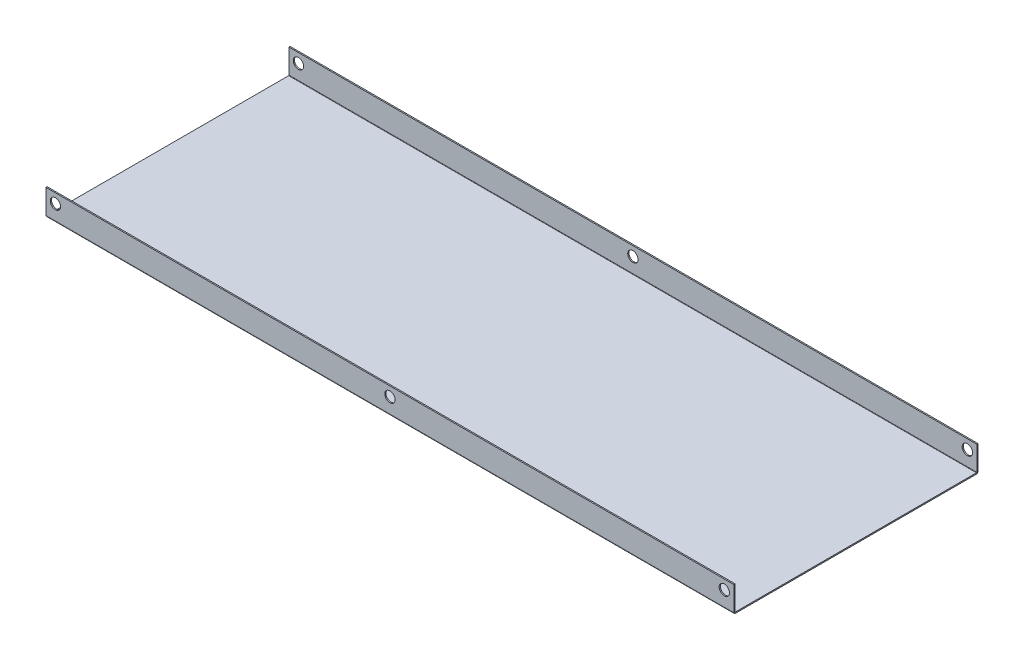
ISO-10303-21;
HEADER;
FILE_DESCRIPTION(('STEP AP214'),'2;1');
FILE_NAME('part.step','',(''),(''),'','','');
FILE_SCHEMA(('AUTOMOTIVE_DESIGN { 1 0 10303 214 1 1 1 1 }'));
ENDSEC;
DATA;
#1=APPLICATION_CONTEXT('core data for automotive mechanical design processes');
#2=APPLICATION_PROTOCOL_DEFINITION('international standard','automotive_design',2000,#1);
#3=PRODUCT_CONTEXT('',#1,'mechanical');
#4=PRODUCT('Part','Part','',(#3));
#5=PRODUCT_RELATED_PRODUCT_CATEGORY('part','',(#4));
#6=PRODUCT_DEFINITION_FORMATION('','',#4);
#7=PRODUCT_DEFINITION_CONTEXT('part definition',#1,'design');
#8=PRODUCT_DEFINITION('design','',#6,#7);
#9=PRODUCT_DEFINITION_SHAPE('','',#8);
#10=(LENGTH_UNIT() NAMED_UNIT(*) SI_UNIT(.MILLI.,.METRE.));
#11=(NAMED_UNIT(*) PLANE_ANGLE_UNIT() SI_UNIT($,.RADIAN.));
#12=(NAMED_UNIT(*) SI_UNIT($,.STERADIAN.) SOLID_ANGLE_UNIT());
#13=UNCERTAINTY_MEASURE_WITH_UNIT(LENGTH_MEASURE(1.E-05),#10,'distance_accuracy_value','');
#14=(GEOMETRIC_REPRESENTATION_CONTEXT(3) GLOBAL_UNCERTAINTY_ASSIGNED_CONTEXT((#13)) GLOBAL_UNIT_ASSIGNED_CONTEXT((#10,
#11,#12)) REPRESENTATION_CONTEXT('',''));
#15=CARTESIAN_POINT('',(0.,0.,0.));
#16=DIRECTION('',(0.,0.,1.));
#17=DIRECTION('',(1.,0.,0.));
#18=AXIS2_PLACEMENT_3D('',#15,#16,#17);
#19=CARTESIAN_POINT('',(0.,-0.7,0.));
#20=DIRECTION('',(0.,-1.,0.));
#21=DIRECTION('',(0.,0.,-1.));
#22=AXIS2_PLACEMENT_3D('',#19,#20,#21);
#23=PLANE('',#22);
#24=DIRECTION('',(0.,0.,-1.));
#25=VECTOR('',#24,1.);
#26=CARTESIAN_POINT('',(200.,-0.7,71.));
#27=LINE('',#26,#25);
#28=CARTESIAN_POINT('',(200.,-0.699999999999993,70.1));
#29=VERTEX_POINT('',#28);
#30=CARTESIAN_POINT('',(200.,-0.7,-70.1));
#31=VERTEX_POINT('',#30);
#32=EDGE_CURVE('E91',#29,#31,#27,.T.);
#33=ORIENTED_EDGE('',*,*,#32,.F.);
#34=DIRECTION('',(1.,0.,0.));
#35=VECTOR('',#34,1.);
#36=CARTESIAN_POINT('',(200.,-0.699999999999993,70.1));
#37=LINE('',#36,#35);
#38=CARTESIAN_POINT('',(-200.,-0.7,70.1));
#39=VERTEX_POINT('',#38);
#40=EDGE_CURVE('E227',#29,#39,#37,.F.);
#41=ORIENTED_EDGE('',*,*,#40,.T.);
#42=DIRECTION('',(0.,0.,1.));
#43=VECTOR('',#42,1.);
#44=CARTESIAN_POINT('',(-200.,-0.7,71.));
#45=LINE('',#44,#43);
#46=CARTESIAN_POINT('',(-200.,-0.700000000000022,-70.1));
#47=VERTEX_POINT('',#46);
#48=EDGE_CURVE('E13',#47,#39,#45,.T.);
#49=ORIENTED_EDGE('',*,*,#48,.F.);
#50=DIRECTION('',(-1.,0.,0.));
#51=VECTOR('',#50,1.);
#52=CARTESIAN_POINT('',(-200.,-0.700000000000022,-70.1));
#53=LINE('',#52,#51);
#54=EDGE_CURVE('E298',#47,#31,#53,.F.);
#55=ORIENTED_EDGE('',*,*,#54,.T.);
#56=EDGE_LOOP('',(#33,#41,#49,#55));
#57=FACE_BOUND('',#56,.T.);
#58=ADVANCED_FACE('F81',(#57),#23,.T.);
#59=CARTESIAN_POINT('',(0.,0.,0.));
#60=DIRECTION('',(0.,-1.,0.));
#61=DIRECTION('',(0.,0.,-1.));
#62=AXIS2_PLACEMENT_3D('',#59,#60,#61);
#63=PLANE('',#62);
#64=DIRECTION('',(1.,0.,0.));
#65=VECTOR('',#64,1.);
#66=CARTESIAN_POINT('',(200.,0.,70.1));
#67=LINE('',#66,#65);
#68=CARTESIAN_POINT('',(200.,0.,70.1));
#69=VERTEX_POINT('',#68);
#70=CARTESIAN_POINT('',(-200.,0.,70.1));
#71=VERTEX_POINT('',#70);
#72=EDGE_CURVE('E242',#69,#71,#67,.F.);
#73=ORIENTED_EDGE('',*,*,#72,.F.);
#74=DIRECTION('',(0.,0.,-1.));
#75=VECTOR('',#74,1.);
#76=CARTESIAN_POINT('',(200.,0.,71.));
#77=LINE('',#76,#75);
#78=CARTESIAN_POINT('',(200.,0.,-70.1));
#79=VERTEX_POINT('',#78);
#80=EDGE_CURVE('E322',#69,#79,#77,.T.);
#81=ORIENTED_EDGE('',*,*,#80,.T.);
#82=DIRECTION('',(-1.,0.,0.));
#83=VECTOR('',#82,1.);
#84=CARTESIAN_POINT('',(-200.,0.,-70.1));
#85=LINE('',#84,#83);
#86=CARTESIAN_POINT('',(-200.,0.,-70.1));
#87=VERTEX_POINT('',#86);
#88=EDGE_CURVE('E313',#87,#79,#85,.F.);
#89=ORIENTED_EDGE('',*,*,#88,.F.);
#90=DIRECTION('',(0.,0.,1.));
#91=VECTOR('',#90,1.);
#92=CARTESIAN_POINT('',(-200.,0.,71.));
#93=LINE('',#92,#91);
#94=EDGE_CURVE('E328',#87,#71,#93,.T.);
#95=ORIENTED_EDGE('',*,*,#94,.T.);
#96=EDGE_LOOP('',(#73,#81,#89,#95));
#97=FACE_BOUND('',#96,.T.);
#98=ADVANCED_FACE('F399',(#97),#63,.F.);
#99=CARTESIAN_POINT('',(200.,-0.7,71.));
#100=DIRECTION('',(1.,0.,0.));
#101=DIRECTION('',(0.,0.,-1.));
#102=AXIS2_PLACEMENT_3D('',#99,#100,#101);
#103=PLANE('',#102);
#104=ORIENTED_EDGE('',*,*,#80,.F.);
#105=DIRECTION('',(0.,-1.,0.));
#106=VECTOR('',#105,1.);
#107=CARTESIAN_POINT('',(200.,0.,70.1));
#108=LINE('',#107,#106);
#109=EDGE_CURVE('E234',#69,#29,#108,.T.);
#110=ORIENTED_EDGE('',*,*,#109,.T.);
#111=ORIENTED_EDGE('',*,*,#32,.T.);
#112=DIRECTION('',(0.,-1.,0.));
#113=VECTOR('',#112,1.);
#114=CARTESIAN_POINT('',(200.,0.,-70.1));
#115=LINE('',#114,#113);
#116=EDGE_CURVE('E319',#79,#31,#115,.T.);
#117=ORIENTED_EDGE('',*,*,#116,.F.);
#118=EDGE_LOOP('',(#104,#110,#111,#117));
#119=FACE_BOUND('',#118,.T.);
#120=ADVANCED_FACE('F83',(#119),#103,.T.);
#121=CARTESIAN_POINT('',(-200.,-0.7,71.));
#122=DIRECTION('',(-1.,0.,0.));
#123=DIRECTION('',(0.,0.,1.));
#124=AXIS2_PLACEMENT_3D('',#121,#122,#123);
#125=PLANE('',#124);
#126=DIRECTION('',(0.,-1.,0.));
#127=VECTOR('',#126,1.);
#128=CARTESIAN_POINT('',(-200.,0.,70.1));
#129=LINE('',#128,#127);
#130=EDGE_CURVE('E249',#71,#39,#129,.T.);
#131=ORIENTED_EDGE('',*,*,#130,.F.);
#132=ORIENTED_EDGE('',*,*,#94,.F.);
#133=DIRECTION('',(0.,-1.,0.));
#134=VECTOR('',#133,1.);
#135=CARTESIAN_POINT('',(-200.,0.,-70.1));
#136=LINE('',#135,#134);
#137=EDGE_CURVE('E305',#87,#47,#136,.T.);
#138=ORIENTED_EDGE('',*,*,#137,.T.);
#139=ORIENTED_EDGE('',*,*,#48,.T.);
#140=EDGE_LOOP('',(#131,#132,#138,#139));
#141=FACE_BOUND('',#140,.T.);
#142=ADVANCED_FACE('F411',(#141),#125,.T.);
#143=CARTESIAN_POINT('',(200.,0.200000000000011,-70.1));
#144=DIRECTION('',(1.,0.,0.));
#145=DIRECTION('',(0.,1.,0.));
#146=AXIS2_PLACEMENT_3D('',#143,#144,#145);
#147=PLANE('',#146);
#148=DIRECTION('',(0.,0.,1.));
#149=VECTOR('',#148,1.);
#150=CARTESIAN_POINT('',(200.,0.200000000000011,-71.));
#151=LINE('',#150,#149);
#152=CARTESIAN_POINT('',(200.,0.20000000000001,-70.3));
#153=VERTEX_POINT('',#152);
#154=CARTESIAN_POINT('',(200.,0.200000000000007,-71.));
#155=VERTEX_POINT('',#154);
#156=EDGE_CURVE('E252',#153,#155,#151,.F.);
#157=ORIENTED_EDGE('',*,*,#156,.F.);
#158=CARTESIAN_POINT('',(200.,0.200000000000011,-70.1));
#159=DIRECTION('',(-1.,0.,0.));
#160=DIRECTION('',(0.,-1.,0.));
#161=AXIS2_PLACEMENT_3D('',#158,#159,#160);
#162=CIRCLE('',#161,0.200000000000006);
#163=EDGE_CURVE('E309',#79,#153,#162,.F.);
#164=ORIENTED_EDGE('',*,*,#163,.F.);
#165=ORIENTED_EDGE('',*,*,#116,.T.);
#166=CARTESIAN_POINT('',(200.,0.200000000000011,-70.1));
#167=DIRECTION('',(-1.,0.,0.));
#168=DIRECTION('',(0.,-1.,0.));
#169=AXIS2_PLACEMENT_3D('',#166,#167,#168);
#170=CIRCLE('',#169,0.900000000000006);
#171=EDGE_CURVE('E99',#31,#155,#170,.F.);
#172=ORIENTED_EDGE('',*,*,#171,.T.);
#173=EDGE_LOOP('',(#157,#164,#165,#172));
#174=FACE_BOUND('',#173,.T.);
#175=ADVANCED_FACE('F413',(#174),#147,.T.);
#176=CARTESIAN_POINT('',(-200.,0.199999999999984,-70.1));
#177=DIRECTION('',(1.,0.,0.));
#178=DIRECTION('',(0.,1.,0.));
#179=AXIS2_PLACEMENT_3D('',#176,#177,#178);
#180=PLANE('',#179);
#181=CARTESIAN_POINT('',(-200.,0.199999999999984,-70.1));
#182=DIRECTION('',(-1.,0.,0.));
#183=DIRECTION('',(0.,-1.,0.));
#184=AXIS2_PLACEMENT_3D('',#181,#182,#183);
#185=CIRCLE('',#184,0.200000000000006);
#186=CARTESIAN_POINT('',(-200.,0.199999999999983,-70.3));
#187=VERTEX_POINT('',#186);
#188=EDGE_CURVE('E260',#187,#87,#185,.T.);
#189=ORIENTED_EDGE('',*,*,#188,.F.);
#190=DIRECTION('',(0.,0.,1.));
#191=VECTOR('',#190,1.);
#192=CARTESIAN_POINT('',(-200.,0.199999999999992,-70.3));
#193=LINE('',#192,#191);
#194=CARTESIAN_POINT('',(-200.,0.199999999999997,-71.));
#195=VERTEX_POINT('',#194);
#196=EDGE_CURVE('E288',#187,#195,#193,.F.);
#197=ORIENTED_EDGE('',*,*,#196,.T.);
#198=CARTESIAN_POINT('',(-200.,0.199999999999984,-70.1));
#199=DIRECTION('',(-1.,0.,0.));
#200=DIRECTION('',(0.,-1.,0.));
#201=AXIS2_PLACEMENT_3D('',#198,#199,#200);
#202=CIRCLE('',#201,0.900000000000006);
#203=EDGE_CURVE('E302',#195,#47,#202,.T.);
#204=ORIENTED_EDGE('',*,*,#203,.T.);
#205=ORIENTED_EDGE('',*,*,#137,.F.);
#206=EDGE_LOOP('',(#189,#197,#204,#205));
#207=FACE_BOUND('',#206,.T.);
#208=ADVANCED_FACE('F409',(#207),#180,.F.);
#209=CARTESIAN_POINT('',(-200.,0.199999999999984,-70.1));
#210=DIRECTION('',(-1.,0.,0.));
#211=DIRECTION('',(0.,0.,-1.));
#212=AXIS2_PLACEMENT_3D('',#209,#210,#211);
#213=CYLINDRICAL_SURFACE('',#212,0.900000000000006);
#214=ORIENTED_EDGE('',*,*,#54,.F.);
#215=ORIENTED_EDGE('',*,*,#203,.F.);
#216=DIRECTION('',(-1.,0.,0.));
#217=VECTOR('',#216,1.);
#218=CARTESIAN_POINT('',(200.,0.200000000000011,-71.));
#219=LINE('',#218,#217);
#220=EDGE_CURVE('E285',#195,#155,#219,.F.);
#221=ORIENTED_EDGE('',*,*,#220,.T.);
#222=ORIENTED_EDGE('',*,*,#171,.F.);
#223=EDGE_LOOP('',(#214,#215,#221,#222));
#224=FACE_BOUND('',#223,.T.);
#225=ADVANCED_FACE('F461',(#224),#213,.T.);
#226=CARTESIAN_POINT('',(-200.,0.199999999999984,-70.1));
#227=DIRECTION('',(-1.,0.,0.));
#228=DIRECTION('',(0.,0.,-1.));
#229=AXIS2_PLACEMENT_3D('',#226,#227,#228);
#230=CYLINDRICAL_SURFACE('',#229,0.200000000000006);
#231=ORIENTED_EDGE('',*,*,#88,.T.);
#232=ORIENTED_EDGE('',*,*,#163,.T.);
#233=DIRECTION('',(-1.,0.,0.));
#234=VECTOR('',#233,1.);
#235=CARTESIAN_POINT('',(200.,0.200000000000006,-70.3));
#236=LINE('',#235,#234);
#237=EDGE_CURVE('E292',#153,#187,#236,.T.);
#238=ORIENTED_EDGE('',*,*,#237,.T.);
#239=ORIENTED_EDGE('',*,*,#188,.T.);
#240=EDGE_LOOP('',(#231,#232,#238,#239));
#241=FACE_BOUND('',#240,.T.);
#242=ADVANCED_FACE('F430',(#241),#230,.F.);
#243=CARTESIAN_POINT('',(-200.,14.3,-71.));
#244=DIRECTION('',(1.,0.,0.));
#245=DIRECTION('',(0.,0.,-1.));
#246=AXIS2_PLACEMENT_3D('',#243,#244,#245);
#247=PLANE('',#246);
#248=ORIENTED_EDGE('',*,*,#196,.F.);
#249=DIRECTION('',(0.,-1.,0.));
#250=VECTOR('',#249,1.);
#251=CARTESIAN_POINT('',(-200.,14.3,-70.3));
#252=LINE('',#251,#250);
#253=CARTESIAN_POINT('',(-200.,14.3,-70.3));
#254=VERTEX_POINT('',#253);
#255=EDGE_CURVE('E282',#187,#254,#252,.F.);
#256=ORIENTED_EDGE('',*,*,#255,.T.);
#257=DIRECTION('',(0.,0.,1.));
#258=VECTOR('',#257,1.);
#259=CARTESIAN_POINT('',(-200.,14.3,-71.));
#260=LINE('',#259,#258);
#261=CARTESIAN_POINT('',(-200.,14.3,-71.));
#262=VERTEX_POINT('',#261);
#263=EDGE_CURVE('E256',#262,#254,#260,.T.);
#264=ORIENTED_EDGE('',*,*,#263,.F.);
#265=DIRECTION('',(0.,1.,0.));
#266=VECTOR('',#265,1.);
#267=CARTESIAN_POINT('',(-200.,-2.78058843749729E-13,-71.));
#268=LINE('',#267,#266);
#269=EDGE_CURVE('E272',#195,#262,#268,.T.);
#270=ORIENTED_EDGE('',*,*,#269,.F.);
#271=EDGE_LOOP('',(#248,#256,#264,#270));
#272=FACE_BOUND('',#271,.T.);
#273=ADVANCED_FACE('F453',(#272),#247,.F.);
#274=CARTESIAN_POINT('',(200.,0.,-71.));
#275=DIRECTION('',(-1.,0.,0.));
#276=DIRECTION('',(0.,-1.,0.));
#277=AXIS2_PLACEMENT_3D('',#274,#275,#276);
#278=PLANE('',#277);
#279=ORIENTED_EDGE('',*,*,#156,.T.);
#280=DIRECTION('',(0.,-1.,0.));
#281=VECTOR('',#280,1.);
#282=CARTESIAN_POINT('',(200.,-6.66248712499784E-13,-71.));
#283=LINE('',#282,#281);
#284=CARTESIAN_POINT('',(200.,14.3,-71.));
#285=VERTEX_POINT('',#284);
#286=EDGE_CURVE('E265',#285,#155,#283,.T.);
#287=ORIENTED_EDGE('',*,*,#286,.F.);
#288=DIRECTION('',(0.,0.,1.));
#289=VECTOR('',#288,1.);
#290=CARTESIAN_POINT('',(200.,14.3,-71.));
#291=LINE('',#290,#289);
#292=CARTESIAN_POINT('',(200.,14.3,-70.3));
#293=VERTEX_POINT('',#292);
#294=EDGE_CURVE('E261',#285,#293,#291,.T.);
#295=ORIENTED_EDGE('',*,*,#294,.T.);
#296=DIRECTION('',(0.,1.,0.));
#297=VECTOR('',#296,1.);
#298=CARTESIAN_POINT('',(200.,0.,-70.3));
#299=LINE('',#298,#297);
#300=EDGE_CURVE('E275',#293,#153,#299,.F.);
#301=ORIENTED_EDGE('',*,*,#300,.T.);
#302=EDGE_LOOP('',(#279,#287,#295,#301));
#303=FACE_BOUND('',#302,.T.);
#304=ADVANCED_FACE('F435',(#303),#278,.F.);
#305=CARTESIAN_POINT('',(0.,-2.78058843749729E-13,-71.));
#306=DIRECTION('',(0.,0.,1.));
#307=DIRECTION('',(0.,-1.,0.));
#308=AXIS2_PLACEMENT_3D('',#305,#306,#307);
#309=PLANE('',#308);
#310=CARTESIAN_POINT('',(194.5,8.8,-71.));
#311=DIRECTION('',(0.,0.,-1.));
#312=DIRECTION('',(0.,1.,0.));
#313=AXIS2_PLACEMENT_3D('',#310,#311,#312);
#314=CIRCLE('',#313,2.99999999999999);
#315=CARTESIAN_POINT('',(194.5,11.8,-71.));
#316=VERTEX_POINT('',#315);
#317=EDGE_CURVE('E341',#316,#316,#314,.T.);
#318=ORIENTED_EDGE('',*,*,#317,.F.);
#319=EDGE_LOOP('',(#318));
#320=FACE_BOUND('',#319,.T.);
#321=CARTESIAN_POINT('',(0.,8.80000000000001,-71.));
#322=DIRECTION('',(0.,0.,-1.));
#323=DIRECTION('',(0.,1.,0.));
#324=AXIS2_PLACEMENT_3D('',#321,#322,#323);
#325=CIRCLE('',#324,3.);
#326=CARTESIAN_POINT('',(0.,11.8,-71.));
#327=VERTEX_POINT('',#326);
#328=EDGE_CURVE('E364',#327,#327,#325,.T.);
#329=ORIENTED_EDGE('',*,*,#328,.F.);
#330=EDGE_LOOP('',(#329));
#331=FACE_BOUND('',#330,.T.);
#332=CARTESIAN_POINT('',(-194.5,8.80000000000005,-71.));
#333=DIRECTION('',(0.,0.,-1.));
#334=DIRECTION('',(0.,-1.,0.));
#335=AXIS2_PLACEMENT_3D('',#332,#333,#334);
#336=CIRCLE('',#335,2.99999999999999);
#337=CARTESIAN_POINT('',(-194.5,5.80000000000005,-71.));
#338=VERTEX_POINT('',#337);
#339=EDGE_CURVE('E359',#338,#338,#336,.T.);
#340=ORIENTED_EDGE('',*,*,#339,.F.);
#341=EDGE_LOOP('',(#340));
#342=FACE_BOUND('',#341,.T.);
#343=ORIENTED_EDGE('',*,*,#220,.F.);
#344=ORIENTED_EDGE('',*,*,#269,.T.);
#345=DIRECTION('',(1.,0.,0.));
#346=VECTOR('',#345,1.);
#347=CARTESIAN_POINT('',(0.,14.3,-71.));
#348=LINE('',#347,#346);
#349=EDGE_CURVE('E269',#262,#285,#348,.T.);
#350=ORIENTED_EDGE('',*,*,#349,.T.);
#351=ORIENTED_EDGE('',*,*,#286,.T.);
#352=EDGE_LOOP('',(#343,#344,#350,#351));
#353=FACE_BOUND('',#352,.T.);
#354=ADVANCED_FACE('F439',(#320,#331,#342,#353),#309,.F.);
#355=CARTESIAN_POINT('',(0.,-2.75614806812539E-13,-70.3));
#356=DIRECTION('',(0.,0.,1.));
#357=DIRECTION('',(0.,-1.,0.));
#358=AXIS2_PLACEMENT_3D('',#355,#356,#357);
#359=PLANE('',#358);
#360=CARTESIAN_POINT('',(194.5,8.8,-70.3));
#361=DIRECTION('',(0.,0.,1.));
#362=DIRECTION('',(0.,-1.,0.));
#363=AXIS2_PLACEMENT_3D('',#360,#361,#362);
#364=CIRCLE('',#363,2.99999999999999);
#365=CARTESIAN_POINT('',(194.5,5.80000000000001,-70.3));
#366=VERTEX_POINT('',#365);
#367=EDGE_CURVE('E226',#366,#366,#364,.T.);
#368=ORIENTED_EDGE('',*,*,#367,.F.);
#369=EDGE_LOOP('',(#368));
#370=FACE_BOUND('',#369,.T.);
#371=CARTESIAN_POINT('',(0.,8.80000000000001,-70.3));
#372=DIRECTION('',(0.,0.,1.));
#373=DIRECTION('',(0.,-1.,0.));
#374=AXIS2_PLACEMENT_3D('',#371,#372,#373);
#375=CIRCLE('',#374,3.);
#376=CARTESIAN_POINT('',(0.,5.80000000000001,-70.3));
#377=VERTEX_POINT('',#376);
#378=EDGE_CURVE('E340',#377,#377,#375,.T.);
#379=ORIENTED_EDGE('',*,*,#378,.F.);
#380=EDGE_LOOP('',(#379));
#381=FACE_BOUND('',#380,.T.);
#382=CARTESIAN_POINT('',(-194.5,8.80000000000005,-70.3));
#383=DIRECTION('',(0.,0.,1.));
#384=DIRECTION('',(0.,-1.,0.));
#385=AXIS2_PLACEMENT_3D('',#382,#383,#384);
#386=CIRCLE('',#385,2.99999999999999);
#387=CARTESIAN_POINT('',(-194.5,5.80000000000005,-70.3));
#388=VERTEX_POINT('',#387);
#389=EDGE_CURVE('E336',#388,#388,#386,.T.);
#390=ORIENTED_EDGE('',*,*,#389,.F.);
#391=EDGE_LOOP('',(#390));
#392=FACE_BOUND('',#391,.T.);
#393=ORIENTED_EDGE('',*,*,#255,.F.);
#394=ORIENTED_EDGE('',*,*,#237,.F.);
#395=ORIENTED_EDGE('',*,*,#300,.F.);
#396=DIRECTION('',(-1.,0.,0.));
#397=VECTOR('',#396,1.);
#398=CARTESIAN_POINT('',(200.,14.3,-70.3));
#399=LINE('',#398,#397);
#400=EDGE_CURVE('E279',#254,#293,#399,.F.);
#401=ORIENTED_EDGE('',*,*,#400,.F.);
#402=EDGE_LOOP('',(#393,#394,#395,#401));
#403=FACE_BOUND('',#402,.T.);
#404=ADVANCED_FACE('F449',(#370,#381,#392,#403),#359,.T.);
#405=CARTESIAN_POINT('',(200.,14.3,-71.));
#406=DIRECTION('',(0.,-1.,0.));
#407=DIRECTION('',(0.,0.,-1.));
#408=AXIS2_PLACEMENT_3D('',#405,#406,#407);
#409=PLANE('',#408);
#410=ORIENTED_EDGE('',*,*,#400,.T.);
#411=ORIENTED_EDGE('',*,*,#294,.F.);
#412=ORIENTED_EDGE('',*,*,#349,.F.);
#413=ORIENTED_EDGE('',*,*,#263,.T.);
#414=EDGE_LOOP('',(#410,#411,#412,#413));
#415=FACE_BOUND('',#414,.T.);
#416=ADVANCED_FACE('F445',(#415),#409,.F.);
#417=CARTESIAN_POINT('',(-200.,0.200000000000013,70.1));
#418=DIRECTION('',(-1.,0.,0.));
#419=DIRECTION('',(0.,0.,1.));
#420=AXIS2_PLACEMENT_3D('',#417,#418,#419);
#421=PLANE('',#420);
#422=DIRECTION('',(0.,0.,-1.));
#423=VECTOR('',#422,1.);
#424=CARTESIAN_POINT('',(-200.,0.200000000000006,71.));
#425=LINE('',#424,#423);
#426=CARTESIAN_POINT('',(-200.,0.200000000000013,70.3));
#427=VERTEX_POINT('',#426);
#428=CARTESIAN_POINT('',(-200.,0.200000000000013,71.));
#429=VERTEX_POINT('',#428);
#430=EDGE_CURVE('E199',#427,#429,#425,.F.);
#431=ORIENTED_EDGE('',*,*,#430,.F.);
#432=CARTESIAN_POINT('',(-200.,0.200000000000013,70.1));
#433=DIRECTION('',(1.,0.,0.));
#434=DIRECTION('',(0.,0.,-1.));
#435=AXIS2_PLACEMENT_3D('',#432,#433,#434);
#436=CIRCLE('',#435,0.200000000000006);
#437=EDGE_CURVE('E238',#71,#427,#436,.F.);
#438=ORIENTED_EDGE('',*,*,#437,.F.);
#439=ORIENTED_EDGE('',*,*,#130,.T.);
#440=CARTESIAN_POINT('',(-200.,0.200000000000013,70.1));
#441=DIRECTION('',(1.,0.,0.));
#442=DIRECTION('',(0.,0.,-1.));
#443=AXIS2_PLACEMENT_3D('',#440,#441,#442);
#444=CIRCLE('',#443,0.900000000000006);
#445=EDGE_CURVE('E107',#39,#429,#444,.F.);
#446=ORIENTED_EDGE('',*,*,#445,.T.);
#447=EDGE_LOOP('',(#431,#438,#439,#446));
#448=FACE_BOUND('',#447,.T.);
#449=ADVANCED_FACE('F469',(#448),#421,.T.);
#450=CARTESIAN_POINT('',(200.,0.200000000000013,70.1));
#451=DIRECTION('',(-1.,0.,0.));
#452=DIRECTION('',(0.,0.,1.));
#453=AXIS2_PLACEMENT_3D('',#450,#451,#452);
#454=PLANE('',#453);
#455=CARTESIAN_POINT('',(200.,0.200000000000013,70.1));
#456=DIRECTION('',(1.,0.,0.));
#457=DIRECTION('',(0.,0.,-1.));
#458=AXIS2_PLACEMENT_3D('',#455,#456,#457);
#459=CIRCLE('',#458,0.200000000000006);
#460=CARTESIAN_POINT('',(200.,0.200000000000013,70.3));
#461=VERTEX_POINT('',#460);
#462=EDGE_CURVE('E245',#461,#69,#459,.T.);
#463=ORIENTED_EDGE('',*,*,#462,.F.);
#464=DIRECTION('',(0.,0.,-1.));
#465=VECTOR('',#464,1.);
#466=CARTESIAN_POINT('',(200.,0.20000000000002,70.3));
#467=LINE('',#466,#465);
#468=CARTESIAN_POINT('',(200.,0.20000000000002,71.));
#469=VERTEX_POINT('',#468);
#470=EDGE_CURVE('E217',#461,#469,#467,.F.);
#471=ORIENTED_EDGE('',*,*,#470,.T.);
#472=CARTESIAN_POINT('',(200.,0.200000000000013,70.1));
#473=DIRECTION('',(1.,0.,0.));
#474=DIRECTION('',(0.,0.,-1.));
#475=AXIS2_PLACEMENT_3D('',#472,#473,#474);
#476=CIRCLE('',#475,0.900000000000006);
#477=EDGE_CURVE('E231',#469,#29,#476,.T.);
#478=ORIENTED_EDGE('',*,*,#477,.T.);
#479=ORIENTED_EDGE('',*,*,#109,.F.);
#480=EDGE_LOOP('',(#463,#471,#478,#479));
#481=FACE_BOUND('',#480,.T.);
#482=ADVANCED_FACE('F385',(#481),#454,.F.);
#483=CARTESIAN_POINT('',(200.,0.200000000000013,70.1));
#484=DIRECTION('',(1.,0.,0.));
#485=DIRECTION('',(0.,0.,1.));
#486=AXIS2_PLACEMENT_3D('',#483,#484,#485);
#487=CYLINDRICAL_SURFACE('',#486,0.900000000000006);
#488=ORIENTED_EDGE('',*,*,#40,.F.);
#489=ORIENTED_EDGE('',*,*,#477,.F.);
#490=DIRECTION('',(1.,0.,0.));
#491=VECTOR('',#490,1.);
#492=CARTESIAN_POINT('',(-200.,0.200000000000006,71.));
#493=LINE('',#492,#491);
#494=EDGE_CURVE('E214',#469,#429,#493,.F.);
#495=ORIENTED_EDGE('',*,*,#494,.T.);
#496=ORIENTED_EDGE('',*,*,#445,.F.);
#497=EDGE_LOOP('',(#488,#489,#495,#496));
#498=FACE_BOUND('',#497,.T.);
#499=ADVANCED_FACE('F394',(#498),#487,.T.);
#500=CARTESIAN_POINT('',(200.,0.200000000000013,70.1));
#501=DIRECTION('',(1.,0.,0.));
#502=DIRECTION('',(0.,0.,1.));
#503=AXIS2_PLACEMENT_3D('',#500,#501,#502);
#504=CYLINDRICAL_SURFACE('',#503,0.200000000000006);
#505=ORIENTED_EDGE('',*,*,#72,.T.);
#506=ORIENTED_EDGE('',*,*,#437,.T.);
#507=DIRECTION('',(1.,0.,0.));
#508=VECTOR('',#507,1.);
#509=CARTESIAN_POINT('',(-200.,0.200000000000006,70.3));
#510=LINE('',#509,#508);
#511=EDGE_CURVE('E221',#427,#461,#510,.T.);
#512=ORIENTED_EDGE('',*,*,#511,.T.);
#513=ORIENTED_EDGE('',*,*,#462,.T.);
#514=EDGE_LOOP('',(#505,#506,#512,#513));
#515=FACE_BOUND('',#514,.T.);
#516=ADVANCED_FACE('F380',(#515),#504,.F.);
#517=CARTESIAN_POINT('',(200.,14.3,71.));
#518=DIRECTION('',(-1.,0.,0.));
#519=DIRECTION('',(0.,-1.,0.));
#520=AXIS2_PLACEMENT_3D('',#517,#518,#519);
#521=PLANE('',#520);
#522=ORIENTED_EDGE('',*,*,#470,.F.);
#523=DIRECTION('',(0.,-1.,0.));
#524=VECTOR('',#523,1.);
#525=CARTESIAN_POINT('',(200.,14.3,70.3));
#526=LINE('',#525,#524);
#527=CARTESIAN_POINT('',(200.,14.3,70.3));
#528=VERTEX_POINT('',#527);
#529=EDGE_CURVE('E211',#461,#528,#526,.F.);
#530=ORIENTED_EDGE('',*,*,#529,.T.);
#531=DIRECTION('',(0.,0.,-1.));
#532=VECTOR('',#531,1.);
#533=CARTESIAN_POINT('',(200.,14.3,71.));
#534=LINE('',#533,#532);
#535=CARTESIAN_POINT('',(200.,14.3,71.));
#536=VERTEX_POINT('',#535);
#537=EDGE_CURVE('E195',#536,#528,#534,.T.);
#538=ORIENTED_EDGE('',*,*,#537,.F.);
#539=DIRECTION('',(0.,1.,0.));
#540=VECTOR('',#539,1.);
#541=CARTESIAN_POINT('',(200.,-3.88189868750055E-13,71.));
#542=LINE('',#541,#540);
#543=EDGE_CURVE('E180',#469,#536,#542,.T.);
#544=ORIENTED_EDGE('',*,*,#543,.F.);
#545=EDGE_LOOP('',(#522,#530,#538,#544));
#546=FACE_BOUND('',#545,.T.);
#547=ADVANCED_FACE('F386',(#546),#521,.F.);
#548=CARTESIAN_POINT('',(-200.,0.,71.));
#549=DIRECTION('',(1.,0.,0.));
#550=DIRECTION('',(0.,0.,-1.));
#551=AXIS2_PLACEMENT_3D('',#548,#549,#550);
#552=PLANE('',#551);
#553=ORIENTED_EDGE('',*,*,#430,.T.);
#554=DIRECTION('',(0.,-1.,0.));
#555=VECTOR('',#554,1.);
#556=CARTESIAN_POINT('',(-200.,0.,71.));
#557=LINE('',#556,#555);
#558=CARTESIAN_POINT('',(-200.,14.3,71.));
#559=VERTEX_POINT('',#558);
#560=EDGE_CURVE('E178',#559,#429,#557,.T.);
#561=ORIENTED_EDGE('',*,*,#560,.F.);
#562=DIRECTION('',(0.,0.,-1.));
#563=VECTOR('',#562,1.);
#564=CARTESIAN_POINT('',(-200.,14.3,71.));
#565=LINE('',#564,#563);
#566=CARTESIAN_POINT('',(-200.,14.3,70.3));
#567=VERTEX_POINT('',#566);
#568=EDGE_CURVE('E187',#559,#567,#565,.T.);
#569=ORIENTED_EDGE('',*,*,#568,.T.);
#570=DIRECTION('',(0.,1.,0.));
#571=VECTOR('',#570,1.);
#572=CARTESIAN_POINT('',(-200.,0.,70.3));
#573=LINE('',#572,#571);
#574=EDGE_CURVE('E206',#567,#427,#573,.F.);
#575=ORIENTED_EDGE('',*,*,#574,.T.);
#576=EDGE_LOOP('',(#553,#561,#569,#575));
#577=FACE_BOUND('',#576,.T.);
#578=ADVANCED_FACE('F198',(#577),#552,.F.);
#579=CARTESIAN_POINT('',(0.,0.,71.));
#580=DIRECTION('',(0.,0.,-1.));
#581=DIRECTION('',(-1.,0.,0.));
#582=AXIS2_PLACEMENT_3D('',#579,#580,#581);
#583=PLANE('',#582);
#584=CARTESIAN_POINT('',(-194.5,8.8,71.));
#585=DIRECTION('',(0.,0.,1.));
#586=DIRECTION('',(1.,0.,0.));
#587=AXIS2_PLACEMENT_3D('',#584,#585,#586);
#588=CIRCLE('',#587,2.99999999999999);
#589=CARTESIAN_POINT('',(-191.5,8.8,71.));
#590=VERTEX_POINT('',#589);
#591=EDGE_CURVE('E352',#590,#590,#588,.T.);
#592=ORIENTED_EDGE('',*,*,#591,.F.);
#593=EDGE_LOOP('',(#592));
#594=FACE_BOUND('',#593,.T.);
#595=CARTESIAN_POINT('',(0.,8.80000000000001,71.));
#596=DIRECTION('',(0.,0.,1.));
#597=DIRECTION('',(1.,0.,0.));
#598=AXIS2_PLACEMENT_3D('',#595,#596,#597);
#599=CIRCLE('',#598,3.);
#600=CARTESIAN_POINT('',(3.,8.80000000000001,71.));
#601=VERTEX_POINT('',#600);
#602=EDGE_CURVE('E525',#601,#601,#599,.T.);
#603=ORIENTED_EDGE('',*,*,#602,.F.);
#604=EDGE_LOOP('',(#603));
#605=FACE_BOUND('',#604,.T.);
#606=CARTESIAN_POINT('',(194.5,8.80000000000005,71.));
#607=DIRECTION('',(0.,0.,1.));
#608=DIRECTION('',(-1.,0.,0.));
#609=AXIS2_PLACEMENT_3D('',#606,#607,#608);
#610=CIRCLE('',#609,2.99999999999999);
#611=CARTESIAN_POINT('',(191.5,8.80000000000005,71.));
#612=VERTEX_POINT('',#611);
#613=EDGE_CURVE('E522',#612,#612,#610,.T.);
#614=ORIENTED_EDGE('',*,*,#613,.F.);
#615=EDGE_LOOP('',(#614));
#616=FACE_BOUND('',#615,.T.);
#617=ORIENTED_EDGE('',*,*,#494,.F.);
#618=ORIENTED_EDGE('',*,*,#543,.T.);
#619=DIRECTION('',(-1.,0.,0.));
#620=VECTOR('',#619,1.);
#621=CARTESIAN_POINT('',(0.,14.3,71.));
#622=LINE('',#621,#620);
#623=EDGE_CURVE('E173',#536,#559,#622,.T.);
#624=ORIENTED_EDGE('',*,*,#623,.T.);
#625=ORIENTED_EDGE('',*,*,#560,.T.);
#626=EDGE_LOOP('',(#617,#618,#624,#625));
#627=FACE_BOUND('',#626,.T.);
#628=ADVANCED_FACE('F176',(#594,#605,#616,#627),#583,.F.);
#629=CARTESIAN_POINT('',(0.,0.,70.3));
#630=DIRECTION('',(0.,0.,-1.));
#631=DIRECTION('',(-1.,0.,0.));
#632=AXIS2_PLACEMENT_3D('',#629,#630,#631);
#633=PLANE('',#632);
#634=CARTESIAN_POINT('',(-194.5,8.8,70.3));
#635=DIRECTION('',(0.,0.,-1.));
#636=DIRECTION('',(-1.,0.,0.));
#637=AXIS2_PLACEMENT_3D('',#634,#635,#636);
#638=CIRCLE('',#637,2.99999999999999);
#639=CARTESIAN_POINT('',(-197.5,8.8,70.3));
#640=VERTEX_POINT('',#639);
#641=EDGE_CURVE('E85',#640,#640,#638,.T.);
#642=ORIENTED_EDGE('',*,*,#641,.F.);
#643=EDGE_LOOP('',(#642));
#644=FACE_BOUND('',#643,.T.);
#645=CARTESIAN_POINT('',(0.,8.80000000000001,70.3));
#646=DIRECTION('',(0.,0.,-1.));
#647=DIRECTION('',(-1.,0.,0.));
#648=AXIS2_PLACEMENT_3D('',#645,#646,#647);
#649=CIRCLE('',#648,3.);
#650=CARTESIAN_POINT('',(-3.,8.80000000000001,70.3));
#651=VERTEX_POINT('',#650);
#652=EDGE_CURVE('E351',#651,#651,#649,.T.);
#653=ORIENTED_EDGE('',*,*,#652,.F.);
#654=EDGE_LOOP('',(#653));
#655=FACE_BOUND('',#654,.T.);
#656=CARTESIAN_POINT('',(194.5,8.80000000000005,70.3));
#657=DIRECTION('',(0.,0.,-1.));
#658=DIRECTION('',(-1.,0.,0.));
#659=AXIS2_PLACEMENT_3D('',#656,#657,#658);
#660=CIRCLE('',#659,2.99999999999999);
#661=CARTESIAN_POINT('',(191.5,8.80000000000005,70.3));
#662=VERTEX_POINT('',#661);
#663=EDGE_CURVE('E348',#662,#662,#660,.T.);
#664=ORIENTED_EDGE('',*,*,#663,.F.);
#665=EDGE_LOOP('',(#664));
#666=FACE_BOUND('',#665,.T.);
#667=ORIENTED_EDGE('',*,*,#529,.F.);
#668=ORIENTED_EDGE('',*,*,#511,.F.);
#669=ORIENTED_EDGE('',*,*,#574,.F.);
#670=DIRECTION('',(1.,0.,0.));
#671=VECTOR('',#670,1.);
#672=CARTESIAN_POINT('',(-200.,14.3,70.3));
#673=LINE('',#672,#671);
#674=EDGE_CURVE('E190',#528,#567,#673,.F.);
#675=ORIENTED_EDGE('',*,*,#674,.F.);
#676=EDGE_LOOP('',(#667,#668,#669,#675));
#677=FACE_BOUND('',#676,.T.);
#678=ADVANCED_FACE('F376',(#644,#655,#666,#677),#633,.T.);
#679=CARTESIAN_POINT('',(-200.,14.3,71.));
#680=DIRECTION('',(0.,-1.,0.));
#681=DIRECTION('',(0.,0.,-1.));
#682=AXIS2_PLACEMENT_3D('',#679,#680,#681);
#683=PLANE('',#682);
#684=ORIENTED_EDGE('',*,*,#674,.T.);
#685=ORIENTED_EDGE('',*,*,#568,.F.);
#686=ORIENTED_EDGE('',*,*,#623,.F.);
#687=ORIENTED_EDGE('',*,*,#537,.T.);
#688=EDGE_LOOP('',(#684,#685,#686,#687));
#689=FACE_BOUND('',#688,.T.);
#690=ADVANCED_FACE('F188',(#689),#683,.F.);
#691=CARTESIAN_POINT('',(-194.5,8.80000000000008,-61.));
#692=DIRECTION('',(0.,0.,-1.));
#693=DIRECTION('',(0.,1.,0.));
#694=AXIS2_PLACEMENT_3D('',#691,#692,#693);
#695=CYLINDRICAL_SURFACE('',#694,2.99999999999999);
#696=ORIENTED_EDGE('',*,*,#389,.T.);
#697=EDGE_LOOP('',(#696));
#698=FACE_BOUND('',#697,.T.);
#699=ORIENTED_EDGE('',*,*,#339,.T.);
#700=EDGE_LOOP('',(#699));
#701=FACE_BOUND('',#700,.T.);
#702=ADVANCED_FACE('F491',(#698,#701),#695,.F.);
#703=CARTESIAN_POINT('',(0.,8.80000000000005,-61.));
#704=DIRECTION('',(0.,0.,-1.));
#705=DIRECTION('',(0.,1.,0.));
#706=AXIS2_PLACEMENT_3D('',#703,#704,#705);
#707=CYLINDRICAL_SURFACE('',#706,3.);
#708=ORIENTED_EDGE('',*,*,#378,.T.);
#709=EDGE_LOOP('',(#708));
#710=FACE_BOUND('',#709,.T.);
#711=ORIENTED_EDGE('',*,*,#328,.T.);
#712=EDGE_LOOP('',(#711));
#713=FACE_BOUND('',#712,.T.);
#714=ADVANCED_FACE('F493',(#710,#713),#707,.F.);
#715=CARTESIAN_POINT('',(194.5,8.80000000000004,-61.));
#716=DIRECTION('',(0.,0.,-1.));
#717=DIRECTION('',(0.,1.,0.));
#718=AXIS2_PLACEMENT_3D('',#715,#716,#717);
#719=CYLINDRICAL_SURFACE('',#718,2.99999999999999);
#720=ORIENTED_EDGE('',*,*,#367,.T.);
#721=EDGE_LOOP('',(#720));
#722=FACE_BOUND('',#721,.T.);
#723=ORIENTED_EDGE('',*,*,#317,.T.);
#724=EDGE_LOOP('',(#723));
#725=FACE_BOUND('',#724,.T.);
#726=ADVANCED_FACE('F499',(#722,#725),#719,.F.);
#727=CARTESIAN_POINT('',(194.5,8.80000000000005,61.));
#728=DIRECTION('',(0.,0.,1.));
#729=DIRECTION('',(1.,0.,0.));
#730=AXIS2_PLACEMENT_3D('',#727,#728,#729);
#731=CYLINDRICAL_SURFACE('',#730,2.99999999999999);
#732=ORIENTED_EDGE('',*,*,#663,.T.);
#733=EDGE_LOOP('',(#732));
#734=FACE_BOUND('',#733,.T.);
#735=ORIENTED_EDGE('',*,*,#613,.T.);
#736=EDGE_LOOP('',(#735));
#737=FACE_BOUND('',#736,.T.);
#738=ADVANCED_FACE('F515',(#734,#737),#731,.F.);
#739=CARTESIAN_POINT('',(0.,8.80000000000001,61.));
#740=DIRECTION('',(0.,0.,1.));
#741=DIRECTION('',(1.,0.,0.));
#742=AXIS2_PLACEMENT_3D('',#739,#740,#741);
#743=CYLINDRICAL_SURFACE('',#742,3.);
#744=ORIENTED_EDGE('',*,*,#652,.T.);
#745=EDGE_LOOP('',(#744));
#746=FACE_BOUND('',#745,.T.);
#747=ORIENTED_EDGE('',*,*,#602,.T.);
#748=EDGE_LOOP('',(#747));
#749=FACE_BOUND('',#748,.T.);
#750=ADVANCED_FACE('F518',(#746,#749),#743,.F.);
#751=CARTESIAN_POINT('',(-194.5,8.8,61.));
#752=DIRECTION('',(0.,0.,1.));
#753=DIRECTION('',(1.,0.,0.));
#754=AXIS2_PLACEMENT_3D('',#751,#752,#753);
#755=CYLINDRICAL_SURFACE('',#754,2.99999999999999);
#756=ORIENTED_EDGE('',*,*,#641,.T.);
#757=EDGE_LOOP('',(#756));
#758=FACE_BOUND('',#757,.T.);
#759=ORIENTED_EDGE('',*,*,#591,.T.);
#760=EDGE_LOOP('',(#759));
#761=FACE_BOUND('',#760,.T.);
#762=ADVANCED_FACE('F546',(#758,#761),#755,.F.);
#763=CLOSED_SHELL('',(#58,#98,#120,#142,#175,#208,#225,#242,#273,#304,#354,#404,#416,#449,#482,
#499,#516,#547,#578,#628,#678,#690,#702,#714,#726,#738,#750,#762));
#764=MANIFOLD_SOLID_BREP('B2',#763);
#765=ADVANCED_BREP_SHAPE_REPRESENTATION('',(#18,#764),#14);
#766=SHAPE_DEFINITION_REPRESENTATION(#9,#765);
ENDSEC;
END-ISO-10303-21;
